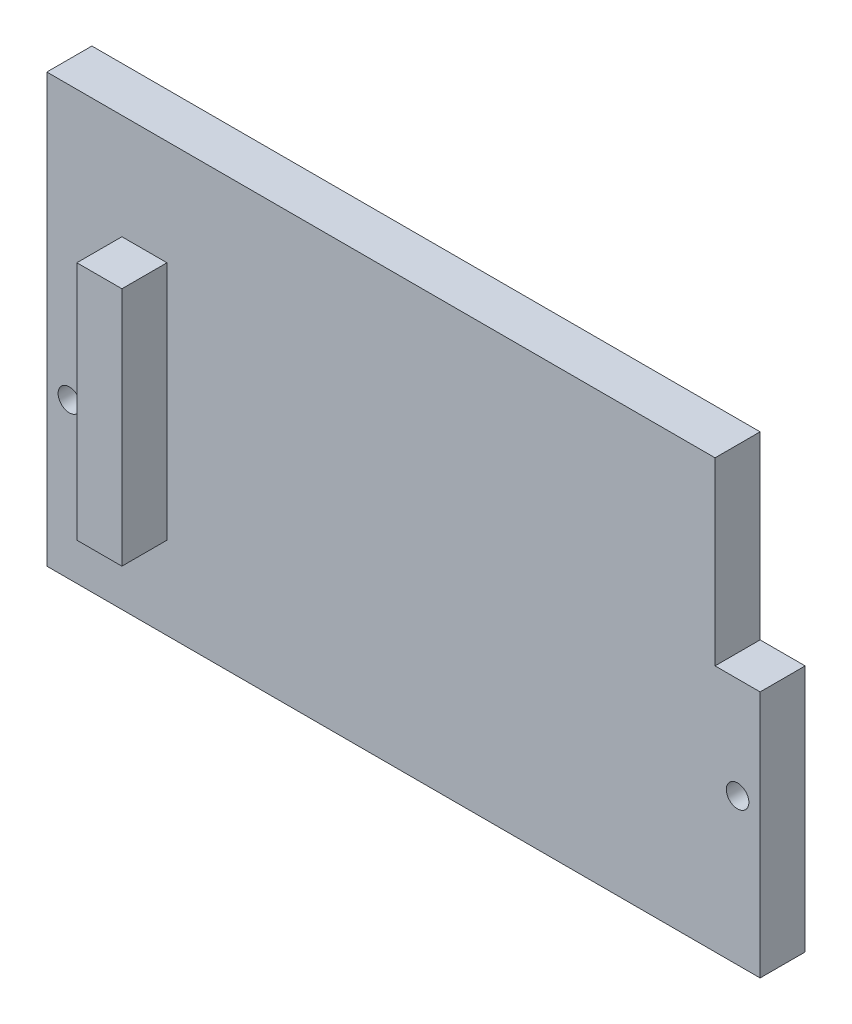
ISO-10303-21;
HEADER;
FILE_DESCRIPTION(('STEP AP214'),'2;1');
FILE_NAME('part.step','',(''),(''),'','','');
FILE_SCHEMA(('AUTOMOTIVE_DESIGN { 1 0 10303 214 1 1 1 1 }'));
ENDSEC;
DATA;
#1=APPLICATION_CONTEXT('core data for automotive mechanical design processes');
#2=APPLICATION_PROTOCOL_DEFINITION('international standard','automotive_design',2000,#1);
#3=PRODUCT_CONTEXT('',#1,'mechanical');
#4=PRODUCT('Part','Part','',(#3));
#5=PRODUCT_RELATED_PRODUCT_CATEGORY('part','',(#4));
#6=PRODUCT_DEFINITION_FORMATION('','',#4);
#7=PRODUCT_DEFINITION_CONTEXT('part definition',#1,'design');
#8=PRODUCT_DEFINITION('design','',#6,#7);
#9=PRODUCT_DEFINITION_SHAPE('','',#8);
#10=(LENGTH_UNIT() NAMED_UNIT(*) SI_UNIT(.MILLI.,.METRE.));
#11=(NAMED_UNIT(*) PLANE_ANGLE_UNIT() SI_UNIT($,.RADIAN.));
#12=(NAMED_UNIT(*) SI_UNIT($,.STERADIAN.) SOLID_ANGLE_UNIT());
#13=UNCERTAINTY_MEASURE_WITH_UNIT(LENGTH_MEASURE(1.E-05),#10,'distance_accuracy_value','');
#14=(GEOMETRIC_REPRESENTATION_CONTEXT(3) GLOBAL_UNCERTAINTY_ASSIGNED_CONTEXT((#13)) GLOBAL_UNIT_ASSIGNED_CONTEXT((#10,
#11,#12)) REPRESENTATION_CONTEXT('',''));
#15=CARTESIAN_POINT('',(0.,0.,0.));
#16=DIRECTION('',(0.,0.,1.));
#17=DIRECTION('',(1.,0.,0.));
#18=AXIS2_PLACEMENT_3D('',#15,#16,#17);
#19=CARTESIAN_POINT('',(0.,0.,6.));
#20=DIRECTION('',(0.,0.,-1.));
#21=DIRECTION('',(-1.,0.,0.));
#22=AXIS2_PLACEMENT_3D('',#19,#20,#21);
#23=PLANE('',#22);
#24=CARTESIAN_POINT('',(-44.5000000000001,-7.81283904102757,6.));
#25=DIRECTION('',(0.,0.,1.));
#26=DIRECTION('',(1.,0.,0.));
#27=AXIS2_PLACEMENT_3D('',#24,#25,#26);
#28=CIRCLE('',#27,1.5);
#29=CARTESIAN_POINT('',(-43.0000000000001,-7.81283904102757,6.));
#30=VERTEX_POINT('',#29);
#31=EDGE_CURVE('E133',#30,#30,#28,.T.);
#32=ORIENTED_EDGE('',*,*,#31,.F.);
#33=EDGE_LOOP('',(#32));
#34=FACE_BOUND('',#33,.T.);
#35=DIRECTION('',(0.,-1.,0.));
#36=VECTOR('',#35,1.);
#37=CARTESIAN_POINT('',(-47.5000000000001,-28.5000000000001,6.));
#38=LINE('',#37,#36);
#39=CARTESIAN_POINT('',(-47.5000000000001,28.4999999999999,6.));
#40=VERTEX_POINT('',#39);
#41=CARTESIAN_POINT('',(-47.5000000000001,-28.5000000000001,6.));
#42=VERTEX_POINT('',#41);
#43=EDGE_CURVE('E148',#40,#42,#38,.T.);
#44=ORIENTED_EDGE('',*,*,#43,.T.);
#45=DIRECTION('',(1.,0.,0.));
#46=VECTOR('',#45,1.);
#47=CARTESIAN_POINT('',(-47.5000000000001,-28.5000000000001,6.));
#48=LINE('',#47,#46);
#49=CARTESIAN_POINT('',(47.4999999999999,-28.5000000000001,6.));
#50=VERTEX_POINT('',#49);
#51=EDGE_CURVE('E151',#42,#50,#48,.T.);
#52=ORIENTED_EDGE('',*,*,#51,.T.);
#53=DIRECTION('',(0.,1.,0.));
#54=VECTOR('',#53,1.);
#55=CARTESIAN_POINT('',(47.4999999999999,-28.5000000000001,6.));
#56=LINE('',#55,#54);
#57=CARTESIAN_POINT('',(47.4999999999999,4.49999999999995,6.));
#58=VERTEX_POINT('',#57);
#59=EDGE_CURVE('E154',#50,#58,#56,.T.);
#60=ORIENTED_EDGE('',*,*,#59,.T.);
#61=DIRECTION('',(-1.,0.,0.));
#62=VECTOR('',#61,1.);
#63=CARTESIAN_POINT('',(47.4999999999999,4.49999999999995,6.));
#64=LINE('',#63,#62);
#65=CARTESIAN_POINT('',(41.4999999999999,4.49999999999995,6.));
#66=VERTEX_POINT('',#65);
#67=EDGE_CURVE('E156',#58,#66,#64,.T.);
#68=ORIENTED_EDGE('',*,*,#67,.T.);
#69=DIRECTION('',(0.,1.,0.));
#70=VECTOR('',#69,1.);
#71=CARTESIAN_POINT('',(41.4999999999999,28.4999999999999,6.));
#72=LINE('',#71,#70);
#73=CARTESIAN_POINT('',(41.4999999999999,28.4999999999999,6.));
#74=VERTEX_POINT('',#73);
#75=EDGE_CURVE('E158',#66,#74,#72,.T.);
#76=ORIENTED_EDGE('',*,*,#75,.T.);
#77=DIRECTION('',(-1.,0.,0.));
#78=VECTOR('',#77,1.);
#79=CARTESIAN_POINT('',(-47.5000000000001,28.4999999999999,6.));
#80=LINE('',#79,#78);
#81=EDGE_CURVE('E160',#74,#40,#80,.T.);
#82=ORIENTED_EDGE('',*,*,#81,.T.);
#83=EDGE_LOOP('',(#44,#52,#60,#68,#76,#82));
#84=FACE_BOUND('',#83,.T.);
#85=CARTESIAN_POINT('',(44.4999999999999,-9.00000000000006,6.));
#86=DIRECTION('',(0.,0.,1.));
#87=DIRECTION('',(1.,0.,0.));
#88=AXIS2_PLACEMENT_3D('',#85,#86,#87);
#89=CIRCLE('',#88,1.5);
#90=CARTESIAN_POINT('',(45.9999999999999,-9.00000000000006,6.));
#91=VERTEX_POINT('',#90);
#92=EDGE_CURVE('E142',#91,#91,#89,.T.);
#93=ORIENTED_EDGE('',*,*,#92,.F.);
#94=EDGE_LOOP('',(#93));
#95=FACE_BOUND('',#94,.T.);
#96=DIRECTION('',(0.,-1.,0.));
#97=VECTOR('',#96,1.);
#98=CARTESIAN_POINT('',(-37.5000000000001,14.4999999999999,6.));
#99=LINE('',#98,#97);
#100=CARTESIAN_POINT('',(-37.5000000000001,14.4999999999999,6.));
#101=VERTEX_POINT('',#100);
#102=CARTESIAN_POINT('',(-37.5000000000001,-17.5000000000001,6.));
#103=VERTEX_POINT('',#102);
#104=EDGE_CURVE('E129',#101,#103,#99,.T.);
#105=ORIENTED_EDGE('',*,*,#104,.F.);
#106=DIRECTION('',(-1.,0.,0.));
#107=VECTOR('',#106,1.);
#108=CARTESIAN_POINT('',(-37.5000000000001,14.4999999999999,6.));
#109=LINE('',#108,#107);
#110=CARTESIAN_POINT('',(-31.5000000000001,14.4999999999999,6.));
#111=VERTEX_POINT('',#110);
#112=EDGE_CURVE('E126',#111,#101,#109,.T.);
#113=ORIENTED_EDGE('',*,*,#112,.F.);
#114=DIRECTION('',(0.,1.,0.));
#115=VECTOR('',#114,1.);
#116=CARTESIAN_POINT('',(-31.5000000000001,14.4999999999999,6.));
#117=LINE('',#116,#115);
#118=CARTESIAN_POINT('',(-31.5000000000001,-17.5000000000001,6.));
#119=VERTEX_POINT('',#118);
#120=EDGE_CURVE('E52',#119,#111,#117,.T.);
#121=ORIENTED_EDGE('',*,*,#120,.F.);
#122=DIRECTION('',(1.,0.,0.));
#123=VECTOR('',#122,1.);
#124=CARTESIAN_POINT('',(-37.5000000000001,-17.5000000000001,6.));
#125=LINE('',#124,#123);
#126=EDGE_CURVE('E47',#103,#119,#125,.T.);
#127=ORIENTED_EDGE('',*,*,#126,.F.);
#128=EDGE_LOOP('',(#105,#113,#121,#127));
#129=FACE_BOUND('',#128,.T.);
#130=ADVANCED_FACE('F32',(#34,#84,#95,#129),#23,.F.);
#131=CARTESIAN_POINT('',(0.,0.,0.));
#132=DIRECTION('',(0.,0.,-1.));
#133=DIRECTION('',(-1.,0.,0.));
#134=AXIS2_PLACEMENT_3D('',#131,#132,#133);
#135=PLANE('',#134);
#136=CARTESIAN_POINT('',(44.4999999999999,-9.00000000000006,0.));
#137=DIRECTION('',(0.,0.,1.));
#138=DIRECTION('',(1.,0.,0.));
#139=AXIS2_PLACEMENT_3D('',#136,#137,#138);
#140=CIRCLE('',#139,1.5);
#141=CARTESIAN_POINT('',(45.9999999999999,-9.00000000000006,0.));
#142=VERTEX_POINT('',#141);
#143=EDGE_CURVE('E140',#142,#142,#140,.T.);
#144=ORIENTED_EDGE('',*,*,#143,.T.);
#145=EDGE_LOOP('',(#144));
#146=FACE_BOUND('',#145,.T.);
#147=DIRECTION('',(0.,-1.,0.));
#148=VECTOR('',#147,1.);
#149=CARTESIAN_POINT('',(-47.5000000000001,-28.5000000000001,0.));
#150=LINE('',#149,#148);
#151=CARTESIAN_POINT('',(-47.5000000000001,28.4999999999999,0.));
#152=VERTEX_POINT('',#151);
#153=CARTESIAN_POINT('',(-47.5000000000001,-28.5000000000001,0.));
#154=VERTEX_POINT('',#153);
#155=EDGE_CURVE('E145',#152,#154,#150,.T.);
#156=ORIENTED_EDGE('',*,*,#155,.F.);
#157=DIRECTION('',(-1.,0.,0.));
#158=VECTOR('',#157,1.);
#159=CARTESIAN_POINT('',(-47.5000000000001,28.4999999999999,0.));
#160=LINE('',#159,#158);
#161=CARTESIAN_POINT('',(41.4999999999999,28.4999999999999,0.));
#162=VERTEX_POINT('',#161);
#163=EDGE_CURVE('E152',#162,#152,#160,.T.);
#164=ORIENTED_EDGE('',*,*,#163,.F.);
#165=DIRECTION('',(0.,1.,0.));
#166=VECTOR('',#165,1.);
#167=CARTESIAN_POINT('',(41.4999999999999,28.4999999999999,0.));
#168=LINE('',#167,#166);
#169=CARTESIAN_POINT('',(41.4999999999999,4.49999999999995,0.));
#170=VERTEX_POINT('',#169);
#171=EDGE_CURVE('E171',#170,#162,#168,.T.);
#172=ORIENTED_EDGE('',*,*,#171,.F.);
#173=DIRECTION('',(-1.,0.,0.));
#174=VECTOR('',#173,1.);
#175=CARTESIAN_POINT('',(47.4999999999999,4.49999999999995,0.));
#176=LINE('',#175,#174);
#177=CARTESIAN_POINT('',(47.4999999999999,4.49999999999995,0.));
#178=VERTEX_POINT('',#177);
#179=EDGE_CURVE('E169',#178,#170,#176,.T.);
#180=ORIENTED_EDGE('',*,*,#179,.F.);
#181=DIRECTION('',(0.,1.,0.));
#182=VECTOR('',#181,1.);
#183=CARTESIAN_POINT('',(47.4999999999999,-28.5000000000001,0.));
#184=LINE('',#183,#182);
#185=CARTESIAN_POINT('',(47.4999999999999,-28.5000000000001,0.));
#186=VERTEX_POINT('',#185);
#187=EDGE_CURVE('E167',#186,#178,#184,.T.);
#188=ORIENTED_EDGE('',*,*,#187,.F.);
#189=DIRECTION('',(1.,0.,0.));
#190=VECTOR('',#189,1.);
#191=CARTESIAN_POINT('',(-47.5000000000001,-28.5000000000001,0.));
#192=LINE('',#191,#190);
#193=EDGE_CURVE('E165',#154,#186,#192,.T.);
#194=ORIENTED_EDGE('',*,*,#193,.F.);
#195=EDGE_LOOP('',(#156,#164,#172,#180,#188,#194));
#196=FACE_BOUND('',#195,.T.);
#197=CARTESIAN_POINT('',(-44.5000000000001,-7.81283904102757,0.));
#198=DIRECTION('',(0.,0.,1.));
#199=DIRECTION('',(1.,0.,0.));
#200=AXIS2_PLACEMENT_3D('',#197,#198,#199);
#201=CIRCLE('',#200,1.5);
#202=CARTESIAN_POINT('',(-43.0000000000001,-7.81283904102757,0.));
#203=VERTEX_POINT('',#202);
#204=EDGE_CURVE('E130',#203,#203,#201,.T.);
#205=ORIENTED_EDGE('',*,*,#204,.T.);
#206=EDGE_LOOP('',(#205));
#207=FACE_BOUND('',#206,.T.);
#208=ADVANCED_FACE('F195',(#146,#196,#207),#135,.T.);
#209=CARTESIAN_POINT('',(-47.5000000000001,-28.5000000000001,6.));
#210=DIRECTION('',(1.,0.,0.));
#211=DIRECTION('',(0.,0.,-1.));
#212=AXIS2_PLACEMENT_3D('',#209,#210,#211);
#213=PLANE('',#212);
#214=ORIENTED_EDGE('',*,*,#155,.T.);
#215=DIRECTION('',(0.,0.,-1.));
#216=VECTOR('',#215,1.);
#217=CARTESIAN_POINT('',(-47.5000000000001,-28.5000000000001,6.));
#218=LINE('',#217,#216);
#219=EDGE_CURVE('E11',#42,#154,#218,.T.);
#220=ORIENTED_EDGE('',*,*,#219,.F.);
#221=ORIENTED_EDGE('',*,*,#43,.F.);
#222=DIRECTION('',(0.,0.,-1.));
#223=VECTOR('',#222,1.);
#224=CARTESIAN_POINT('',(-47.5000000000001,28.4999999999999,6.));
#225=LINE('',#224,#223);
#226=EDGE_CURVE('E162',#40,#152,#225,.T.);
#227=ORIENTED_EDGE('',*,*,#226,.T.);
#228=EDGE_LOOP('',(#214,#220,#221,#227));
#229=FACE_BOUND('',#228,.T.);
#230=ADVANCED_FACE('F34',(#229),#213,.F.);
#231=CARTESIAN_POINT('',(-47.5000000000001,-28.5000000000001,6.));
#232=DIRECTION('',(0.,1.,0.));
#233=DIRECTION('',(-1.,0.,0.));
#234=AXIS2_PLACEMENT_3D('',#231,#232,#233);
#235=PLANE('',#234);
#236=ORIENTED_EDGE('',*,*,#193,.T.);
#237=DIRECTION('',(0.,0.,-1.));
#238=VECTOR('',#237,1.);
#239=CARTESIAN_POINT('',(47.4999999999999,-28.5000000000001,6.));
#240=LINE('',#239,#238);
#241=EDGE_CURVE('E40',#50,#186,#240,.T.);
#242=ORIENTED_EDGE('',*,*,#241,.F.);
#243=ORIENTED_EDGE('',*,*,#51,.F.);
#244=ORIENTED_EDGE('',*,*,#219,.T.);
#245=EDGE_LOOP('',(#236,#242,#243,#244));
#246=FACE_BOUND('',#245,.T.);
#247=ADVANCED_FACE('F213',(#246),#235,.F.);
#248=CARTESIAN_POINT('',(47.4999999999999,-28.5000000000001,6.));
#249=DIRECTION('',(-1.,0.,0.));
#250=DIRECTION('',(0.,-1.,0.));
#251=AXIS2_PLACEMENT_3D('',#248,#249,#250);
#252=PLANE('',#251);
#253=ORIENTED_EDGE('',*,*,#187,.T.);
#254=DIRECTION('',(0.,0.,-1.));
#255=VECTOR('',#254,1.);
#256=CARTESIAN_POINT('',(47.4999999999999,4.49999999999995,6.));
#257=LINE('',#256,#255);
#258=EDGE_CURVE('E182',#58,#178,#257,.T.);
#259=ORIENTED_EDGE('',*,*,#258,.F.);
#260=ORIENTED_EDGE('',*,*,#59,.F.);
#261=ORIENTED_EDGE('',*,*,#241,.T.);
#262=EDGE_LOOP('',(#253,#259,#260,#261));
#263=FACE_BOUND('',#262,.T.);
#264=ADVANCED_FACE('F189',(#263),#252,.F.);
#265=CARTESIAN_POINT('',(47.4999999999999,4.49999999999995,6.));
#266=DIRECTION('',(0.,-1.,0.));
#267=DIRECTION('',(0.,0.,-1.));
#268=AXIS2_PLACEMENT_3D('',#265,#266,#267);
#269=PLANE('',#268);
#270=ORIENTED_EDGE('',*,*,#179,.T.);
#271=DIRECTION('',(0.,0.,-1.));
#272=VECTOR('',#271,1.);
#273=CARTESIAN_POINT('',(41.4999999999999,4.49999999999995,6.));
#274=LINE('',#273,#272);
#275=EDGE_CURVE('E179',#66,#170,#274,.T.);
#276=ORIENTED_EDGE('',*,*,#275,.F.);
#277=ORIENTED_EDGE('',*,*,#67,.F.);
#278=ORIENTED_EDGE('',*,*,#258,.T.);
#279=EDGE_LOOP('',(#270,#276,#277,#278));
#280=FACE_BOUND('',#279,.T.);
#281=ADVANCED_FACE('F201',(#280),#269,.F.);
#282=CARTESIAN_POINT('',(41.4999999999999,28.4999999999999,6.));
#283=DIRECTION('',(-1.,0.,0.));
#284=DIRECTION('',(0.,0.,1.));
#285=AXIS2_PLACEMENT_3D('',#282,#283,#284);
#286=PLANE('',#285);
#287=ORIENTED_EDGE('',*,*,#171,.T.);
#288=DIRECTION('',(0.,0.,-1.));
#289=VECTOR('',#288,1.);
#290=CARTESIAN_POINT('',(41.4999999999999,28.4999999999999,6.));
#291=LINE('',#290,#289);
#292=EDGE_CURVE('E176',#74,#162,#291,.T.);
#293=ORIENTED_EDGE('',*,*,#292,.F.);
#294=ORIENTED_EDGE('',*,*,#75,.F.);
#295=ORIENTED_EDGE('',*,*,#275,.T.);
#296=EDGE_LOOP('',(#287,#293,#294,#295));
#297=FACE_BOUND('',#296,.T.);
#298=ADVANCED_FACE('F205',(#297),#286,.F.);
#299=CARTESIAN_POINT('',(-47.5000000000001,28.4999999999999,6.));
#300=DIRECTION('',(0.,-1.,0.));
#301=DIRECTION('',(0.,0.,-1.));
#302=AXIS2_PLACEMENT_3D('',#299,#300,#301);
#303=PLANE('',#302);
#304=ORIENTED_EDGE('',*,*,#163,.T.);
#305=ORIENTED_EDGE('',*,*,#226,.F.);
#306=ORIENTED_EDGE('',*,*,#81,.F.);
#307=ORIENTED_EDGE('',*,*,#292,.T.);
#308=EDGE_LOOP('',(#304,#305,#306,#307));
#309=FACE_BOUND('',#308,.T.);
#310=ADVANCED_FACE('F216',(#309),#303,.F.);
#311=CARTESIAN_POINT('',(44.4999999999999,-9.00000000000006,6.));
#312=DIRECTION('',(0.,0.,-1.));
#313=DIRECTION('',(-1.,0.,0.));
#314=AXIS2_PLACEMENT_3D('',#311,#312,#313);
#315=CYLINDRICAL_SURFACE('',#314,1.5);
#316=ORIENTED_EDGE('',*,*,#92,.T.);
#317=EDGE_LOOP('',(#316));
#318=FACE_BOUND('',#317,.T.);
#319=ORIENTED_EDGE('',*,*,#143,.F.);
#320=EDGE_LOOP('',(#319));
#321=FACE_BOUND('',#320,.T.);
#322=ADVANCED_FACE('F218',(#318,#321),#315,.F.);
#323=CARTESIAN_POINT('',(-44.5000000000001,-7.81283904102757,6.));
#324=DIRECTION('',(0.,0.,-1.));
#325=DIRECTION('',(-1.,0.,0.));
#326=AXIS2_PLACEMENT_3D('',#323,#324,#325);
#327=CYLINDRICAL_SURFACE('',#326,1.5);
#328=ORIENTED_EDGE('',*,*,#31,.T.);
#329=EDGE_LOOP('',(#328));
#330=FACE_BOUND('',#329,.T.);
#331=ORIENTED_EDGE('',*,*,#204,.F.);
#332=EDGE_LOOP('',(#331));
#333=FACE_BOUND('',#332,.T.);
#334=ADVANCED_FACE('F224',(#330,#333),#327,.F.);
#335=CARTESIAN_POINT('',(-37.5000000000001,14.4999999999999,12.));
#336=DIRECTION('',(1.,0.,0.));
#337=DIRECTION('',(0.,1.,0.));
#338=AXIS2_PLACEMENT_3D('',#335,#336,#337);
#339=PLANE('',#338);
#340=ORIENTED_EDGE('',*,*,#104,.T.);
#341=DIRECTION('',(0.,0.,-1.));
#342=VECTOR('',#341,1.);
#343=CARTESIAN_POINT('',(-37.5000000000001,-17.5000000000001,12.));
#344=LINE('',#343,#342);
#345=CARTESIAN_POINT('',(-37.5000000000001,-17.5000000000001,12.));
#346=VERTEX_POINT('',#345);
#347=EDGE_CURVE('E110',#346,#103,#344,.T.);
#348=ORIENTED_EDGE('',*,*,#347,.F.);
#349=DIRECTION('',(0.,-1.,0.));
#350=VECTOR('',#349,1.);
#351=CARTESIAN_POINT('',(-37.5000000000001,14.4999999999999,12.));
#352=LINE('',#351,#350);
#353=CARTESIAN_POINT('',(-37.5000000000001,14.4999999999999,12.));
#354=VERTEX_POINT('',#353);
#355=EDGE_CURVE('E117',#354,#346,#352,.T.);
#356=ORIENTED_EDGE('',*,*,#355,.F.);
#357=DIRECTION('',(0.,0.,-1.));
#358=VECTOR('',#357,1.);
#359=CARTESIAN_POINT('',(-37.5000000000001,14.4999999999999,12.));
#360=LINE('',#359,#358);
#361=EDGE_CURVE('E348',#354,#101,#360,.T.);
#362=ORIENTED_EDGE('',*,*,#361,.T.);
#363=EDGE_LOOP('',(#340,#348,#356,#362));
#364=FACE_BOUND('',#363,.T.);
#365=ADVANCED_FACE('F128',(#364),#339,.F.);
#366=CARTESIAN_POINT('',(-37.5000000000001,-17.5000000000001,12.));
#367=DIRECTION('',(0.,1.,0.));
#368=DIRECTION('',(-1.,0.,0.));
#369=AXIS2_PLACEMENT_3D('',#366,#367,#368);
#370=PLANE('',#369);
#371=ORIENTED_EDGE('',*,*,#126,.T.);
#372=DIRECTION('',(0.,0.,-1.));
#373=VECTOR('',#372,1.);
#374=CARTESIAN_POINT('',(-31.5000000000001,-17.5000000000001,12.));
#375=LINE('',#374,#373);
#376=CARTESIAN_POINT('',(-31.5000000000001,-17.5000000000001,12.));
#377=VERTEX_POINT('',#376);
#378=EDGE_CURVE('E113',#377,#119,#375,.T.);
#379=ORIENTED_EDGE('',*,*,#378,.F.);
#380=DIRECTION('',(1.,0.,0.));
#381=VECTOR('',#380,1.);
#382=CARTESIAN_POINT('',(-37.5000000000001,-17.5000000000001,12.));
#383=LINE('',#382,#381);
#384=EDGE_CURVE('E106',#346,#377,#383,.T.);
#385=ORIENTED_EDGE('',*,*,#384,.F.);
#386=ORIENTED_EDGE('',*,*,#347,.T.);
#387=EDGE_LOOP('',(#371,#379,#385,#386));
#388=FACE_BOUND('',#387,.T.);
#389=ADVANCED_FACE('F108',(#388),#370,.F.);
#390=CARTESIAN_POINT('',(-31.5000000000001,14.4999999999999,12.));
#391=DIRECTION('',(-1.,0.,0.));
#392=DIRECTION('',(0.,0.,1.));
#393=AXIS2_PLACEMENT_3D('',#390,#391,#392);
#394=PLANE('',#393);
#395=ORIENTED_EDGE('',*,*,#120,.T.);
#396=DIRECTION('',(0.,0.,-1.));
#397=VECTOR('',#396,1.);
#398=CARTESIAN_POINT('',(-31.5000000000001,14.4999999999999,12.));
#399=LINE('',#398,#397);
#400=CARTESIAN_POINT('',(-31.5000000000001,14.4999999999999,12.));
#401=VERTEX_POINT('',#400);
#402=EDGE_CURVE('E135',#401,#111,#399,.T.);
#403=ORIENTED_EDGE('',*,*,#402,.F.);
#404=DIRECTION('',(0.,1.,0.));
#405=VECTOR('',#404,1.);
#406=CARTESIAN_POINT('',(-31.5000000000001,14.4999999999999,12.));
#407=LINE('',#406,#405);
#408=EDGE_CURVE('E116',#377,#401,#407,.T.);
#409=ORIENTED_EDGE('',*,*,#408,.F.);
#410=ORIENTED_EDGE('',*,*,#378,.T.);
#411=EDGE_LOOP('',(#395,#403,#409,#410));
#412=FACE_BOUND('',#411,.T.);
#413=ADVANCED_FACE('F245',(#412),#394,.F.);
#414=CARTESIAN_POINT('',(-37.5000000000001,14.4999999999999,12.));
#415=DIRECTION('',(0.,-1.,0.));
#416=DIRECTION('',(0.,0.,-1.));
#417=AXIS2_PLACEMENT_3D('',#414,#415,#416);
#418=PLANE('',#417);
#419=ORIENTED_EDGE('',*,*,#112,.T.);
#420=ORIENTED_EDGE('',*,*,#361,.F.);
#421=DIRECTION('',(-1.,0.,0.));
#422=VECTOR('',#421,1.);
#423=CARTESIAN_POINT('',(-37.5000000000001,14.4999999999999,12.));
#424=LINE('',#423,#422);
#425=EDGE_CURVE('E122',#401,#354,#424,.T.);
#426=ORIENTED_EDGE('',*,*,#425,.F.);
#427=ORIENTED_EDGE('',*,*,#402,.T.);
#428=EDGE_LOOP('',(#419,#420,#426,#427));
#429=FACE_BOUND('',#428,.T.);
#430=ADVANCED_FACE('F248',(#429),#418,.F.);
#431=CARTESIAN_POINT('',(0.,0.,12.));
#432=DIRECTION('',(0.,0.,1.));
#433=DIRECTION('',(1.,0.,0.));
#434=AXIS2_PLACEMENT_3D('',#431,#432,#433);
#435=PLANE('',#434);
#436=ORIENTED_EDGE('',*,*,#355,.T.);
#437=ORIENTED_EDGE('',*,*,#384,.T.);
#438=ORIENTED_EDGE('',*,*,#408,.T.);
#439=ORIENTED_EDGE('',*,*,#425,.T.);
#440=EDGE_LOOP('',(#436,#437,#438,#439));
#441=FACE_BOUND('',#440,.T.);
#442=ADVANCED_FACE('F120',(#441),#435,.T.);
#443=CLOSED_SHELL('',(#130,#208,#230,#247,#264,#281,#298,#310,#322,#334,#365,#389,#413,#430,#442));
#444=MANIFOLD_SOLID_BREP('B2',#443);
#445=ADVANCED_BREP_SHAPE_REPRESENTATION('',(#18,#444),#14);
#446=SHAPE_DEFINITION_REPRESENTATION(#9,#445);
ENDSEC;
END-ISO-10303-21;
